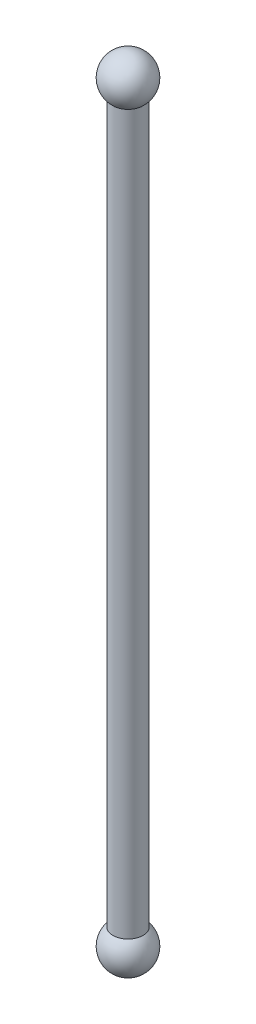
ISO-10303-21;
HEADER;
FILE_DESCRIPTION(('STEP AP214'),'2;1');
FILE_NAME('part.step','',(''),(''),'','','');
FILE_SCHEMA(('AUTOMOTIVE_DESIGN { 1 0 10303 214 1 1 1 1 }'));
ENDSEC;
DATA;
#1=APPLICATION_CONTEXT('core data for automotive mechanical design processes');
#2=APPLICATION_PROTOCOL_DEFINITION('international standard','automotive_design',2000,#1);
#3=PRODUCT_CONTEXT('',#1,'mechanical');
#4=PRODUCT('Part','Part','',(#3));
#5=PRODUCT_RELATED_PRODUCT_CATEGORY('part','',(#4));
#6=PRODUCT_DEFINITION_FORMATION('','',#4);
#7=PRODUCT_DEFINITION_CONTEXT('part definition',#1,'design');
#8=PRODUCT_DEFINITION('design','',#6,#7);
#9=PRODUCT_DEFINITION_SHAPE('','',#8);
#10=(LENGTH_UNIT() NAMED_UNIT(*) SI_UNIT(.MILLI.,.METRE.));
#11=(NAMED_UNIT(*) PLANE_ANGLE_UNIT() SI_UNIT($,.RADIAN.));
#12=(NAMED_UNIT(*) SI_UNIT($,.STERADIAN.) SOLID_ANGLE_UNIT());
#13=UNCERTAINTY_MEASURE_WITH_UNIT(LENGTH_MEASURE(1.E-05),#10,'distance_accuracy_value','');
#14=(GEOMETRIC_REPRESENTATION_CONTEXT(3) GLOBAL_UNCERTAINTY_ASSIGNED_CONTEXT((#13)) GLOBAL_UNIT_ASSIGNED_CONTEXT((#10,
#11,#12)) REPRESENTATION_CONTEXT('',''));
#15=CARTESIAN_POINT('',(0.,0.,0.));
#16=DIRECTION('',(0.,0.,1.));
#17=DIRECTION('',(1.,0.,0.));
#18=AXIS2_PLACEMENT_3D('',#15,#16,#17);
#19=CARTESIAN_POINT('',(0.,-239.,0.));
#20=DIRECTION('',(0.,-1.,0.));
#21=DIRECTION('',(1.,0.,0.));
#22=AXIS2_PLACEMENT_3D('',#19,#20,#21);
#23=CYLINDRICAL_SURFACE('',#22,10.);
#24=CARTESIAN_POINT('',(0.,-239.,0.));
#25=DIRECTION('',(0.,-1.,0.));
#26=DIRECTION('',(1.,0.,0.));
#27=AXIS2_PLACEMENT_3D('',#24,#25,#26);
#28=CIRCLE('',#27,10.);
#29=CARTESIAN_POINT('',(10.,-239.,0.));
#30=VERTEX_POINT('',#29);
#31=EDGE_CURVE('E10',#30,#30,#28,.T.);
#32=ORIENTED_EDGE('',*,*,#31,.F.);
#33=EDGE_LOOP('',(#32));
#34=FACE_BOUND('',#33,.T.);
#35=CARTESIAN_POINT('',(0.,239.,0.));
#36=DIRECTION('',(0.,-1.,0.));
#37=DIRECTION('',(0.,0.,-1.));
#38=AXIS2_PLACEMENT_3D('',#35,#36,#37);
#39=CIRCLE('',#38,10.0000000000001);
#40=CARTESIAN_POINT('',(0.,239.,-10.0000000000001));
#41=VERTEX_POINT('',#40);
#42=EDGE_CURVE('E37',#41,#41,#39,.T.);
#43=ORIENTED_EDGE('',*,*,#42,.T.);
#44=EDGE_LOOP('',(#43));
#45=FACE_BOUND('',#44,.T.);
#46=ADVANCED_FACE('F31',(#34,#45),#23,.T.);
#47=CARTESIAN_POINT('',(0.,250.180339887499,0.));
#48=DIRECTION('',(0.,-1.,0.));
#49=DIRECTION('',(-1.,0.,0.));
#50=AXIS2_PLACEMENT_3D('',#47,#48,#49);
#51=SPHERICAL_SURFACE('',#50,15.);
#52=ORIENTED_EDGE('',*,*,#42,.F.);
#53=EDGE_LOOP('',(#52));
#54=FACE_BOUND('',#53,.T.);
#55=ADVANCED_FACE('F44',(#54),#51,.T.);
#56=CARTESIAN_POINT('',(0.,-250.180339887499,0.));
#57=DIRECTION('',(0.,1.,0.));
#58=DIRECTION('',(-1.,0.,0.));
#59=AXIS2_PLACEMENT_3D('',#56,#57,#58);
#60=SPHERICAL_SURFACE('',#59,15.);
#61=ORIENTED_EDGE('',*,*,#31,.T.);
#62=EDGE_LOOP('',(#61));
#63=FACE_BOUND('',#62,.T.);
#64=ADVANCED_FACE('F46',(#63),#60,.T.);
#65=CLOSED_SHELL('',(#46,#55,#64));
#66=MANIFOLD_SOLID_BREP('B2',#65);
#67=ADVANCED_BREP_SHAPE_REPRESENTATION('',(#18,#66),#14);
#68=SHAPE_DEFINITION_REPRESENTATION(#9,#67);
ENDSEC;
END-ISO-10303-21;
